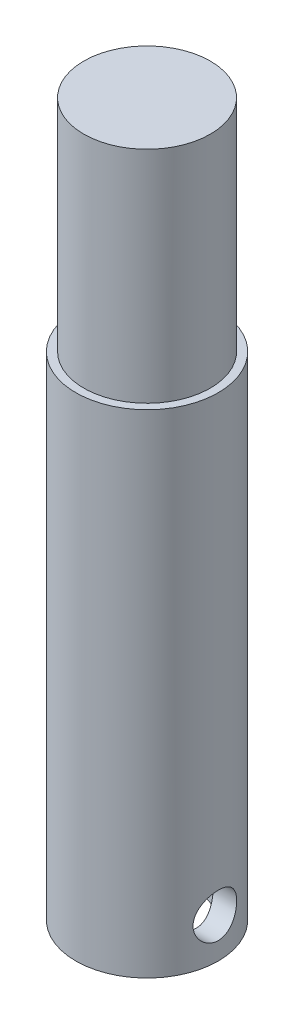
ISO-10303-21;
HEADER;
FILE_DESCRIPTION(('STEP AP214'),'2;1');
FILE_NAME('part.step','',(''),(''),'','','');
FILE_SCHEMA(('AUTOMOTIVE_DESIGN { 1 0 10303 214 1 1 1 1 }'));
ENDSEC;
DATA;
#1=APPLICATION_CONTEXT('core data for automotive mechanical design processes');
#2=APPLICATION_PROTOCOL_DEFINITION('international standard','automotive_design',2000,#1);
#3=PRODUCT_CONTEXT('',#1,'mechanical');
#4=PRODUCT('Part','Part','',(#3));
#5=PRODUCT_RELATED_PRODUCT_CATEGORY('part','',(#4));
#6=PRODUCT_DEFINITION_FORMATION('','',#4);
#7=PRODUCT_DEFINITION_CONTEXT('part definition',#1,'design');
#8=PRODUCT_DEFINITION('design','',#6,#7);
#9=PRODUCT_DEFINITION_SHAPE('','',#8);
#10=(LENGTH_UNIT() NAMED_UNIT(*) SI_UNIT(.MILLI.,.METRE.));
#11=(NAMED_UNIT(*) PLANE_ANGLE_UNIT() SI_UNIT($,.RADIAN.));
#12=(NAMED_UNIT(*) SI_UNIT($,.STERADIAN.) SOLID_ANGLE_UNIT());
#13=UNCERTAINTY_MEASURE_WITH_UNIT(LENGTH_MEASURE(1.E-05),#10,'distance_accuracy_value','');
#14=(GEOMETRIC_REPRESENTATION_CONTEXT(3) GLOBAL_UNCERTAINTY_ASSIGNED_CONTEXT((#13)) GLOBAL_UNIT_ASSIGNED_CONTEXT((#10,
#11,#12)) REPRESENTATION_CONTEXT('',''));
#15=CARTESIAN_POINT('',(0.,0.,0.));
#16=DIRECTION('',(0.,0.,1.));
#17=DIRECTION('',(1.,0.,0.));
#18=AXIS2_PLACEMENT_3D('',#15,#16,#17);
#19=CARTESIAN_POINT('',(0.,0.,0.));
#20=DIRECTION('',(0.,1.,0.));
#21=DIRECTION('',(0.,0.,1.));
#22=AXIS2_PLACEMENT_3D('',#19,#20,#21);
#23=PLANE('',#22);
#24=CARTESIAN_POINT('',(0.,0.,0.));
#25=DIRECTION('',(0.,-1.,0.));
#26=DIRECTION('',(0.,0.,-1.));
#27=AXIS2_PLACEMENT_3D('',#24,#25,#26);
#28=CIRCLE('',#27,3.96875);
#29=CARTESIAN_POINT('',(0.,0.,-3.96875));
#30=VERTEX_POINT('',#29);
#31=EDGE_CURVE('E117',#30,#30,#28,.T.);
#32=ORIENTED_EDGE('',*,*,#31,.F.);
#33=EDGE_LOOP('',(#32));
#34=FACE_BOUND('',#33,.T.);
#35=CARTESIAN_POINT('',(0.,0.,0.));
#36=DIRECTION('',(0.,1.,0.));
#37=DIRECTION('',(0.,0.,1.));
#38=AXIS2_PLACEMENT_3D('',#35,#36,#37);
#39=CIRCLE('',#38,5.715);
#40=CARTESIAN_POINT('',(0.,0.,5.715));
#41=VERTEX_POINT('',#40);
#42=EDGE_CURVE('E120',#41,#41,#39,.T.);
#43=ORIENTED_EDGE('',*,*,#42,.F.);
#44=EDGE_LOOP('',(#43));
#45=FACE_BOUND('',#44,.T.);
#46=ADVANCED_FACE('F45',(#34,#45),#23,.F.);
#47=CARTESIAN_POINT('',(0.,6.35,0.));
#48=DIRECTION('',(0.,-1.,0.));
#49=DIRECTION('',(0.,0.,-1.));
#50=AXIS2_PLACEMENT_3D('',#47,#48,#49);
#51=CYLINDRICAL_SURFACE('',#50,3.96875);
#52=CARTESIAN_POINT('',(-3.56208879205727,3.175,-1.75));
#53=CARTESIAN_POINT('',(-3.56209353838593,3.08224740691797,-1.74999563319547));
#54=CARTESIAN_POINT('',(-3.56576407056318,2.98934259981376,-1.74257902061585));
#55=CARTESIAN_POINT('',(-3.57995211973844,2.80626235860172,-1.71323438723364));
#56=CARTESIAN_POINT('',(-3.5904871603377,2.71609452964493,-1.69126922476247));
#57=CARTESIAN_POINT('',(-3.61696251479822,2.54146570624595,-1.63387370994394));
#58=CARTESIAN_POINT('',(-3.63287896212464,2.45698145522823,-1.59850273000797));
#59=CARTESIAN_POINT('',(-3.66828751091445,2.29516823960994,-1.51547774519868));
#60=CARTESIAN_POINT('',(-3.68777906305451,2.21783817849355,-1.46782562689624));
#61=CARTESIAN_POINT('',(-3.72966266869336,2.06708166582086,-1.35803293293338));
#62=CARTESIAN_POINT('',(-3.75216027824898,1.99421391145088,-1.29516509833842));
#63=CARTESIAN_POINT('',(-3.7966585858724,1.85963705486942,-1.15824885061117));
#64=CARTESIAN_POINT('',(-3.81865907520989,1.79793256639501,-1.08419583778055));
#65=CARTESIAN_POINT('',(-3.86099382006362,1.68446054672912,-0.922506160523575));
#66=CARTESIAN_POINT('',(-3.88119127911691,1.63333780227249,-0.83437788622718));
#67=CARTESIAN_POINT('',(-3.91633169743546,1.54688960151139,-0.649718371395728));
#68=CARTESIAN_POINT('',(-3.93127725444704,1.51155633290805,-0.553191314708836));
#69=CARTESIAN_POINT('',(-3.95347834999868,1.45976542764851,-0.360355757586166));
#70=CARTESIAN_POINT('',(-3.96112637963048,1.44233993556338,-0.264353338726685));
#71=CARTESIAN_POINT('',(-3.96930722106238,1.42371534042764,-0.0705036002533178));
#72=CARTESIAN_POINT('',(-3.96984328957249,1.42250881038484,0.0273428543820264));
#73=CARTESIAN_POINT('',(-3.96395886355778,1.43588531871159,0.215001917879778));
#74=CARTESIAN_POINT('',(-3.95800899588929,1.4494001107015,0.304908340775179));
#75=CARTESIAN_POINT('',(-3.9404855814644,1.48998259360306,0.481024011713773));
#76=CARTESIAN_POINT('',(-3.92891161837739,1.5170512878636,0.567232985534499));
#77=CARTESIAN_POINT('',(-3.90101968793415,1.58426926754532,0.735104863073158));
#78=CARTESIAN_POINT('',(-3.88463198291737,1.62461196920836,0.816678254143855));
#79=CARTESIAN_POINT('',(-3.84868139397731,1.71702809000756,0.972111971682959));
#80=CARTESIAN_POINT('',(-3.82911735624179,1.76910577458765,1.04596947925099));
#81=CARTESIAN_POINT('',(-3.78695193640457,1.88819626988817,1.18997020754851));
#82=CARTESIAN_POINT('',(-3.7642326663637,1.95605425426668,1.25938087431697));
#83=CARTESIAN_POINT('',(-3.71941135415986,2.10243498505653,1.38617737278033));
#84=CARTESIAN_POINT('',(-3.69730961437482,2.18096284941567,1.44355740002509));
#85=CARTESIAN_POINT('',(-3.65532460083709,2.3504296743786,1.54687431413554));
#86=CARTESIAN_POINT('',(-3.63556733412784,2.44174233830917,1.59225401038565));
#87=CARTESIAN_POINT('',(-3.60205795871447,2.63181194458514,1.66668544323578));
#88=CARTESIAN_POINT('',(-3.58830096562557,2.7305627549909,1.69575046597237));
#89=CARTESIAN_POINT('',(-3.56960518418745,2.92534472715134,1.73474330947598));
#90=CARTESIAN_POINT('',(-3.56411638258773,3.02108214651399,1.74586863973841));
#91=CARTESIAN_POINT('',(-3.56100105508922,3.21319290466881,1.75221765766862));
#92=CARTESIAN_POINT('',(-3.56337121546327,3.30956595834333,1.74744804742538));
#93=CARTESIAN_POINT('',(-3.57513324783105,3.49252520823142,1.7232383324921));
#94=CARTESIAN_POINT('',(-3.58398179461918,3.57930117106894,1.70493236127572));
#95=CARTESIAN_POINT('',(-3.60697879849733,3.74845544413854,1.65572114712787));
#96=CARTESIAN_POINT('',(-3.62112859785241,3.83083263457101,1.62481271310638));
#97=CARTESIAN_POINT('',(-3.65389481747196,3.99296259218139,1.54976490211927));
#98=CARTESIAN_POINT('',(-3.67268195932917,4.07243551616474,1.50509802943803));
#99=CARTESIAN_POINT('',(-3.71238927150009,4.22316743507872,1.40430554568507));
#100=CARTESIAN_POINT('',(-3.73331043383616,4.29442257679055,1.34817459314898));
#101=CARTESIAN_POINT('',(-3.77727956071602,4.43362099149512,1.21989455557735));
#102=CARTESIAN_POINT('',(-3.80034398865355,4.50063639388688,1.14674005876275));
#103=CARTESIAN_POINT('',(-3.84422469457359,4.62164138857364,0.989723349920827));
#104=CARTESIAN_POINT('',(-3.86504067624988,4.67562926522068,0.905859729786865));
#105=CARTESIAN_POINT('',(-3.90233949997183,4.76925178626268,0.728677439196114));
#106=CARTESIAN_POINT('',(-3.91878776807016,4.80877279273064,0.635290981699206));
#107=CARTESIAN_POINT('',(-3.94522903213664,4.8712202956881,0.442273890308923));
#108=CARTESIAN_POINT('',(-3.95522638147468,4.89415798460713,0.34264751730459));
#109=CARTESIAN_POINT('',(-3.96708486555638,4.92125842265785,0.148218466465073));
#110=CARTESIAN_POINT('',(-3.96951062715961,4.92672486607173,0.0536309408712299));
#111=CARTESIAN_POINT('',(-3.96757122067091,4.92232672090087,-0.135104825907965));
#112=CARTESIAN_POINT('',(-3.96320751248676,4.91246542816763,-0.229253157165397));
#113=CARTESIAN_POINT('',(-3.94849255842105,4.87862346373568,-0.4102177359374));
#114=CARTESIAN_POINT('',(-3.93840800526532,4.85527088780818,-0.497175040256969));
#115=CARTESIAN_POINT('',(-3.913420989435,4.79583685216382,-0.665875986453617));
#116=CARTESIAN_POINT('',(-3.89851767217411,4.7597531345322,-0.747618700465384));
#117=CARTESIAN_POINT('',(-3.86445798292642,4.6740574513603,-0.907714806758724));
#118=CARTESIAN_POINT('',(-3.84513801057888,4.62390132695005,-0.985741229116449));
#119=CARTESIAN_POINT('',(-3.80446881641556,4.51223907776838,-1.13261229457055));
#120=CARTESIAN_POINT('',(-3.78311874898595,4.45072821317317,-1.20145308254436));
#121=CARTESIAN_POINT('',(-3.73869080353766,4.31251361184784,-1.33356456338859));
#122=CARTESIAN_POINT('',(-3.71560713068347,4.23500231939152,-1.39599136661912));
#123=CARTESIAN_POINT('',(-3.67193674837275,4.06996527552658,-1.50712793845824));
#124=CARTESIAN_POINT('',(-3.65135157638443,3.98243342162634,-1.55582928514161));
#125=CARTESIAN_POINT('',(-3.61524974380851,3.79920497474954,-1.6379790330275));
#126=CARTESIAN_POINT('',(-3.59974592369513,3.70348845643481,-1.67138887600855));
#127=CARTESIAN_POINT('',(-3.57621311955068,3.50702445583213,-1.72117916216989));
#128=CARTESIAN_POINT('',(-3.56815906490183,3.4062950584507,-1.73761674380392));
#129=CARTESIAN_POINT('',(-3.56366883587143,3.28332782715188,-1.74677964847133));
#130=CARTESIAN_POINT('',(-3.56307756802898,3.26168661239528,-1.74798610752484));
#131=CARTESIAN_POINT('',(-3.5622869863916,3.21836637296077,-1.74959680371416));
#132=CARTESIAN_POINT('',(-3.56208768227397,3.19668734736256,-1.75000102104323));
#133=CARTESIAN_POINT('',(-3.56208879205727,3.175,-1.75));
#134=B_SPLINE_CURVE_WITH_KNOTS('',3,(#52,#53,#54,#55,#56,#57,#58,#59,#60,#61,#62,#63,#64,#65,
#66,#67,#68,#69,#70,#71,#72,#73,#74,#75,#76,#77,#78,#79,#80,#81,#82,#83,#84,#85,#86,#87,#88,#89,
#90,#91,#92,#93,#94,#95,#96,#97,#98,#99,#100,#101,#102,#103,#104,#105,#106,#107,#108,#109,#110,
#111,#112,#113,#114,#115,#116,#117,#118,#119,#120,#121,#122,#123,#124,#125,#126,#127,#128,#129,
#130,#131,#132,#133),.UNSPECIFIED.,.T.,.F.,(4,2,2,2,2,2,2,2,2,2,2,2,2,2,2,2,2,2,2,2,2,2,2,2,2,2,
2,2,2,2,2,2,2,2,2,2,2,2,2,2,4),(0.,0.278166493433298,0.557045882401051,0.834704320937761,
1.11232013228369,1.40754438936983,1.70289038420353,2.01288757708766,2.3227312196294,
2.61477292458695,2.90668089315732,3.17873660303953,3.45081245525045,3.72704262376208,
4.0033733591295,4.30113958614739,4.5990491481955,4.90901711969207,5.21873229581556,
5.50676075035845,5.79466777330182,6.06085047730066,6.32710062375157,6.60519700096026,
6.88342324856538,7.18758462827953,7.49178604241135,7.79832814657264,8.10466316539236,
8.38753046958766,8.67033695856148,8.94093121191268,9.21157348029251,9.4946179362679,
9.7777808121338,10.0828667001033,10.3881393828817,10.6941776402949,10.9991822028825,
11.0642212948376,11.1292619925394),.UNSPECIFIED.);
#135=CARTESIAN_POINT('',(-3.56208879205727,3.175,-1.75));
#136=VERTEX_POINT('',#135);
#137=EDGE_CURVE('E95',#136,#136,#134,.T.);
#138=ORIENTED_EDGE('',*,*,#137,.T.);
#139=EDGE_LOOP('',(#138));
#140=FACE_BOUND('',#139,.T.);
#141=CARTESIAN_POINT('',(3.56208879205727,3.175,-1.75));
#142=CARTESIAN_POINT('',(3.56209353838593,3.26775259308203,-1.74999563319547));
#143=CARTESIAN_POINT('',(3.56576407056318,3.36065740018624,-1.74257902061585));
#144=CARTESIAN_POINT('',(3.57995211973844,3.54373764139828,-1.71323438723364));
#145=CARTESIAN_POINT('',(3.5904871603377,3.63390547035507,-1.69126922476247));
#146=CARTESIAN_POINT('',(3.61696251479822,3.80853429375405,-1.63387370994394));
#147=CARTESIAN_POINT('',(3.63287896212464,3.89301854477177,-1.59850273000797));
#148=CARTESIAN_POINT('',(3.66828751091445,4.05483176039005,-1.51547774519868));
#149=CARTESIAN_POINT('',(3.68777906305451,4.13216182150645,-1.46782562689624));
#150=CARTESIAN_POINT('',(3.72966266869336,4.28291833417914,-1.35803293293338));
#151=CARTESIAN_POINT('',(3.75216027824898,4.35578608854912,-1.29516509833842));
#152=CARTESIAN_POINT('',(3.7966585858724,4.49036294513058,-1.15824885061117));
#153=CARTESIAN_POINT('',(3.81865907520989,4.55206743360499,-1.08419583778055));
#154=CARTESIAN_POINT('',(3.86099382006362,4.66553945327088,-0.922506160523575));
#155=CARTESIAN_POINT('',(3.88119127911691,4.71666219772751,-0.834377886227179));
#156=CARTESIAN_POINT('',(3.91633169743546,4.80311039848861,-0.649718371395727));
#157=CARTESIAN_POINT('',(3.93127725444704,4.83844366709194,-0.553191314708836));
#158=CARTESIAN_POINT('',(3.95347834999868,4.89023457235149,-0.360355757586165));
#159=CARTESIAN_POINT('',(3.96112637963048,4.90766006443662,-0.264353338726685));
#160=CARTESIAN_POINT('',(3.96930722106238,4.92628465957236,-0.0705036002533174));
#161=CARTESIAN_POINT('',(3.96984328957249,4.92749118961516,0.0273428543820268));
#162=CARTESIAN_POINT('',(3.96395886355778,4.91411468128841,0.215001917879779));
#163=CARTESIAN_POINT('',(3.95800899588929,4.9005998892985,0.304908340775179));
#164=CARTESIAN_POINT('',(3.9404855814644,4.86001740639694,0.481024011713773));
#165=CARTESIAN_POINT('',(3.92891161837739,4.8329487121364,0.567232985534499));
#166=CARTESIAN_POINT('',(3.90101968793415,4.76573073245468,0.735104863073158));
#167=CARTESIAN_POINT('',(3.88463198291737,4.72538803079164,0.816678254143855));
#168=CARTESIAN_POINT('',(3.84868139397731,4.63297190999244,0.972111971682959));
#169=CARTESIAN_POINT('',(3.82911735624179,4.58089422541235,1.04596947925099));
#170=CARTESIAN_POINT('',(3.78695193640457,4.46180373011183,1.18997020754851));
#171=CARTESIAN_POINT('',(3.7642326663637,4.39394574573332,1.25938087431697));
#172=CARTESIAN_POINT('',(3.71941135415986,4.24756501494346,1.38617737278033));
#173=CARTESIAN_POINT('',(3.69730961437482,4.16903715058433,1.44355740002509));
#174=CARTESIAN_POINT('',(3.65532460083709,3.9995703256214,1.54687431413554));
#175=CARTESIAN_POINT('',(3.63556733412784,3.90825766169083,1.59225401038565));
#176=CARTESIAN_POINT('',(3.60205795871447,3.71818805541486,1.66668544323578));
#177=CARTESIAN_POINT('',(3.58830096562557,3.6194372450091,1.69575046597237));
#178=CARTESIAN_POINT('',(3.56960518418745,3.42465527284866,1.73474330947598));
#179=CARTESIAN_POINT('',(3.56411638258773,3.32891785348601,1.74586863973841));
#180=CARTESIAN_POINT('',(3.56100105508922,3.13680709533119,1.75221765766862));
#181=CARTESIAN_POINT('',(3.56337121546327,3.04043404165667,1.74744804742538));
#182=CARTESIAN_POINT('',(3.57513324783105,2.85747479176858,1.7232383324921));
#183=CARTESIAN_POINT('',(3.58398179461918,2.77069882893106,1.70493236127572));
#184=CARTESIAN_POINT('',(3.60697879849733,2.60154455586146,1.65572114712787));
#185=CARTESIAN_POINT('',(3.62112859785241,2.51916736542899,1.62481271310638));
#186=CARTESIAN_POINT('',(3.65389481747196,2.35703740781861,1.54976490211927));
#187=CARTESIAN_POINT('',(3.67268195932917,2.27756448383526,1.50509802943803));
#188=CARTESIAN_POINT('',(3.71238927150009,2.12683256492128,1.40430554568507));
#189=CARTESIAN_POINT('',(3.73331043383616,2.05557742320946,1.34817459314898));
#190=CARTESIAN_POINT('',(3.77727956071602,1.91637900850488,1.21989455557736));
#191=CARTESIAN_POINT('',(3.80034398865355,1.84936360611312,1.14674005876275));
#192=CARTESIAN_POINT('',(3.84422469457359,1.72835861142636,0.989723349920828));
#193=CARTESIAN_POINT('',(3.86504067624988,1.67437073477932,0.905859729786866));
#194=CARTESIAN_POINT('',(3.90233949997183,1.58074821373732,0.728677439196115));
#195=CARTESIAN_POINT('',(3.91878776807016,1.54122720726936,0.635290981699207));
#196=CARTESIAN_POINT('',(3.94522903213664,1.4787797043119,0.442273890308924));
#197=CARTESIAN_POINT('',(3.95522638147468,1.45584201539287,0.342647517304591));
#198=CARTESIAN_POINT('',(3.96708486555638,1.42874157734215,0.148218466465074));
#199=CARTESIAN_POINT('',(3.96951062715961,1.42327513392827,0.0536309408712306));
#200=CARTESIAN_POINT('',(3.96757122067091,1.42767327909913,-0.135104825907965));
#201=CARTESIAN_POINT('',(3.96320751248676,1.43753457183237,-0.229253157165396));
#202=CARTESIAN_POINT('',(3.94849255842105,1.47137653626432,-0.410217735937399));
#203=CARTESIAN_POINT('',(3.93840800526532,1.49472911219182,-0.497175040256968));
#204=CARTESIAN_POINT('',(3.913420989435,1.55416314783618,-0.665875986453616));
#205=CARTESIAN_POINT('',(3.89851767217411,1.5902468654678,-0.747618700465384));
#206=CARTESIAN_POINT('',(3.86445798292642,1.6759425486397,-0.907714806758724));
#207=CARTESIAN_POINT('',(3.84513801057888,1.72609867304995,-0.985741229116449));
#208=CARTESIAN_POINT('',(3.80446881641556,1.83776092223162,-1.13261229457055));
#209=CARTESIAN_POINT('',(3.78311874898595,1.89927178682683,-1.20145308254436));
#210=CARTESIAN_POINT('',(3.73869080353766,2.03748638815215,-1.33356456338859));
#211=CARTESIAN_POINT('',(3.71560713068347,2.11499768060848,-1.39599136661912));
#212=CARTESIAN_POINT('',(3.67193674837275,2.28003472447342,-1.50712793845824));
#213=CARTESIAN_POINT('',(3.65135157638443,2.36756657837366,-1.55582928514161));
#214=CARTESIAN_POINT('',(3.61524974380851,2.55079502525046,-1.6379790330275));
#215=CARTESIAN_POINT('',(3.59974592369513,2.64651154356518,-1.67138887600855));
#216=CARTESIAN_POINT('',(3.57621311955068,2.84297554416787,-1.72117916216989));
#217=CARTESIAN_POINT('',(3.56815906490183,2.9437049415493,-1.73761674380392));
#218=CARTESIAN_POINT('',(3.56366883587143,3.06667217284812,-1.74677964847133));
#219=CARTESIAN_POINT('',(3.56307756802898,3.08831338760472,-1.74798610752484));
#220=CARTESIAN_POINT('',(3.5622869863916,3.13163362703923,-1.74959680371416));
#221=CARTESIAN_POINT('',(3.56208768227397,3.15331265263744,-1.75000102104323));
#222=CARTESIAN_POINT('',(3.56208879205727,3.175,-1.75));
#223=B_SPLINE_CURVE_WITH_KNOTS('',3,(#141,#142,#143,#144,#145,#146,#147,#148,#149,#150,#151,
#152,#153,#154,#155,#156,#157,#158,#159,#160,#161,#162,#163,#164,#165,#166,#167,#168,#169,#170,
#171,#172,#173,#174,#175,#176,#177,#178,#179,#180,#181,#182,#183,#184,#185,#186,#187,#188,#189,
#190,#191,#192,#193,#194,#195,#196,#197,#198,#199,#200,#201,#202,#203,#204,#205,#206,#207,#208,
#209,#210,#211,#212,#213,#214,#215,#216,#217,#218,#219,#220,#221,#222),.UNSPECIFIED.,.T.,.F.,(4,
2,2,2,2,2,2,2,2,2,2,2,2,2,2,2,2,2,2,2,2,2,2,2,2,2,2,2,2,2,2,2,2,2,2,2,2,2,2,2,4),(0.,
0.278166493433298,0.557045882401051,0.83470432093776,1.11232013228369,1.40754438936983,
1.70289038420353,2.01288757708766,2.3227312196294,2.61477292458695,2.90668089315732,
3.17873660303953,3.45081245525045,3.72704262376208,4.0033733591295,4.30113958614739,
4.5990491481955,4.90901711969207,5.21873229581556,5.50676075035845,5.79466777330182,
6.06085047730066,6.32710062375157,6.60519700096026,6.88342324856538,7.18758462827953,
7.49178604241135,7.79832814657264,8.10466316539236,8.38753046958766,8.67033695856148,
8.94093121191268,9.21157348029251,9.4946179362679,9.7777808121338,10.0828667001033,
10.3881393828817,10.6941776402949,10.9991822028825,11.0642212948376,11.1292619925394),.UNSPECIFIED.);
#224=CARTESIAN_POINT('',(3.56208879205727,3.175,-1.75));
#225=VERTEX_POINT('',#224);
#226=EDGE_CURVE('E88',#225,#225,#223,.T.);
#227=ORIENTED_EDGE('',*,*,#226,.T.);
#228=EDGE_LOOP('',(#227));
#229=FACE_BOUND('',#228,.T.);
#230=CARTESIAN_POINT('',(0.,6.35,0.));
#231=DIRECTION('',(0.,-1.,0.));
#232=DIRECTION('',(0.,0.,-1.));
#233=AXIS2_PLACEMENT_3D('',#230,#231,#232);
#234=CIRCLE('',#233,3.96875);
#235=CARTESIAN_POINT('',(0.,6.35,-3.96875));
#236=VERTEX_POINT('',#235);
#237=EDGE_CURVE('E130',#236,#236,#234,.T.);
#238=ORIENTED_EDGE('',*,*,#237,.F.);
#239=EDGE_LOOP('',(#238));
#240=FACE_BOUND('',#239,.T.);
#241=ORIENTED_EDGE('',*,*,#31,.T.);
#242=EDGE_LOOP('',(#241));
#243=FACE_BOUND('',#242,.T.);
#244=ADVANCED_FACE('F100',(#140,#229,#240,#243),#51,.F.);
#245=CARTESIAN_POINT('',(0.,6.35,0.));
#246=DIRECTION('',(0.,-1.,0.));
#247=DIRECTION('',(0.,0.,-1.));
#248=AXIS2_PLACEMENT_3D('',#245,#246,#247);
#249=PLANE('',#248);
#250=ORIENTED_EDGE('',*,*,#237,.T.);
#251=EDGE_LOOP('',(#250));
#252=FACE_BOUND('',#251,.T.);
#253=ADVANCED_FACE('F104',(#252),#249,.T.);
#254=CARTESIAN_POINT('',(0.,39.497,0.));
#255=DIRECTION('',(0.,-1.,0.));
#256=DIRECTION('',(0.,0.,-1.));
#257=AXIS2_PLACEMENT_3D('',#254,#255,#256);
#258=CYLINDRICAL_SURFACE('',#257,5.715);
#259=CARTESIAN_POINT('',(-5.715,1.425,0.));
#260=CARTESIAN_POINT('',(-5.71499933878539,1.42500090502686,0.0959105376349673));
#261=CARTESIAN_POINT('',(-5.71256267092111,1.43291077613335,0.191830286094759));
#262=CARTESIAN_POINT('',(-5.70308070171076,1.46426232295809,0.380870678624068));
#263=CARTESIAN_POINT('',(-5.69603418963078,1.48770807905694,0.47399058061693));
#264=CARTESIAN_POINT('',(-5.6781034926652,1.54927093803264,0.654677652829268));
#265=CARTESIAN_POINT('',(-5.66722510937339,1.58736586947046,0.742252982565757));
#266=CARTESIAN_POINT('',(-5.64275766193928,1.6770531017474,0.909772960374643));
#267=CARTESIAN_POINT('',(-5.62916820406674,1.72864736343807,0.98971649758304));
#268=CARTESIAN_POINT('',(-5.6002720150372,1.84548708937687,1.14208483325031));
#269=CARTESIAN_POINT('',(-5.5849289894191,1.91106170147808,1.21425032829375));
#270=CARTESIAN_POINT('',(-5.55446831605243,2.05329953161953,1.346750974844));
#271=CARTESIAN_POINT('',(-5.5393507086191,2.1299647075413,1.40708403306271));
#272=CARTESIAN_POINT('',(-5.51066587497236,2.29442644406832,1.51559207971788));
#273=CARTESIAN_POINT('',(-5.49714360070039,2.38244281682218,1.56344691216123));
#274=CARTESIAN_POINT('',(-5.47372461841809,2.56575495925193,1.64356891695786));
#275=CARTESIAN_POINT('',(-5.46382699857342,2.66104889085229,1.67584001027832));
#276=CARTESIAN_POINT('',(-5.44915689171517,2.85329222282893,1.72293664903074));
#277=CARTESIAN_POINT('',(-5.44424388487618,2.9501131330558,1.738241710659));
#278=CARTESIAN_POINT('',(-5.43968164439273,3.1450635323483,1.7524695450511));
#279=CARTESIAN_POINT('',(-5.44003107483807,3.24319268298744,1.75139647552864));
#280=CARTESIAN_POINT('',(-5.44582993585211,3.43404175543601,1.73327436202092));
#281=CARTESIAN_POINT('',(-5.45108620258058,3.52682598043924,1.71683038151631));
#282=CARTESIAN_POINT('',(-5.4657933474506,3.70824977385141,1.66941250842952));
#283=CARTESIAN_POINT('',(-5.47524465519698,3.79688891674379,1.63843712770043));
#284=CARTESIAN_POINT('',(-5.49742809254365,3.96896735338063,1.56239914319658));
#285=CARTESIAN_POINT('',(-5.51020475828325,4.05231530923917,1.51714338581371));
#286=CARTESIAN_POINT('',(-5.53757839025475,4.21043467481122,1.41396348717052));
#287=CARTESIAN_POINT('',(-5.55217581297127,4.28520392468788,1.3560361662491));
#288=CARTESIAN_POINT('',(-5.58232542263652,4.42746981229585,1.2261701590826));
#289=CARTESIAN_POINT('',(-5.59789148602254,4.49450713688054,1.15373063383097));
#290=CARTESIAN_POINT('',(-5.62766171466692,4.61559153203309,0.998443926443386));
#291=CARTESIAN_POINT('',(-5.64186578685801,4.66963771527287,0.915596033977553));
#292=CARTESIAN_POINT('',(-5.66745073888408,4.7635003752016,0.740984772884136));
#293=CARTESIAN_POINT('',(-5.678810473439,4.80321119001861,0.649161298714906));
#294=CARTESIAN_POINT('',(-5.69727432238391,4.86648838595196,0.45970962674507));
#295=CARTESIAN_POINT('',(-5.70437967536649,4.89005946617137,0.362083127506562));
#296=CARTESIAN_POINT('',(-5.71333659948943,4.91961468920723,0.167698452183473));
#297=CARTESIAN_POINT('',(-5.7153739390807,4.9262209850956,0.0710432911954652));
#298=CARTESIAN_POINT('',(-5.71451246151643,4.92340801384639,-0.122002790174385));
#299=CARTESIAN_POINT('',(-5.71161433372543,4.91399098477703,-0.218393745575812));
#300=CARTESIAN_POINT('',(-5.70132940087086,4.87990000061465,-0.405801649791657));
#301=CARTESIAN_POINT('',(-5.69405058776105,4.85559286455543,-0.496891817671331));
#302=CARTESIAN_POINT('',(-5.67585114377866,4.79285607135071,-0.673678392958762));
#303=CARTESIAN_POINT('',(-5.66493006889489,4.75442469232613,-0.759374141243088));
#304=CARTESIAN_POINT('',(-5.64025038629359,4.66350717393184,-0.925202674061905));
#305=CARTESIAN_POINT('',(-5.62643052247156,4.61070878054488,-1.00515489711667));
#306=CARTESIAN_POINT('',(-5.59753683558334,4.49293303553034,-1.15527486363836));
#307=CARTESIAN_POINT('',(-5.58246268598276,4.42795250691563,-1.22544004639289));
#308=CARTESIAN_POINT('',(-5.55204102313051,4.28473217991202,-1.356755524352));
#309=CARTESIAN_POINT('',(-5.53670483924734,4.20608283769874,-1.4174627564114));
#310=CARTESIAN_POINT('',(-5.50809841381302,4.03937987562082,-1.52485284571177));
#311=CARTESIAN_POINT('',(-5.49482812796774,3.95132645745361,-1.57153600365744));
#312=CARTESIAN_POINT('',(-5.47200635749272,3.76854905147947,-1.64924671300812));
#313=CARTESIAN_POINT('',(-5.46243894096489,3.67385575967808,-1.68034150926182));
#314=CARTESIAN_POINT('',(-5.44817281599433,3.48022690078843,-1.72604236233823));
#315=CARTESIAN_POINT('',(-5.44347234941757,3.38129287907786,-1.74065437356286));
#316=CARTESIAN_POINT('',(-5.43965048518986,3.1866078609664,-1.75255871859854));
#317=CARTESIAN_POINT('',(-5.44029570120774,3.09090518271927,-1.75057554013731));
#318=CARTESIAN_POINT('',(-5.44652850350312,2.90126627713779,-1.73108480170035));
#319=CARTESIAN_POINT('',(-5.45211587611416,2.80732997361627,-1.71357791286808));
#320=CARTESIAN_POINT('',(-5.46744363230402,2.62512929313146,-1.66401302274156));
#321=CARTESIAN_POINT('',(-5.47712698469422,2.53680550350335,-1.63215446792962));
#322=CARTESIAN_POINT('',(-5.49954310774988,2.36668617764634,-1.55494667341684));
#323=CARTESIAN_POINT('',(-5.51227648041581,2.28489193444711,-1.50959477002588));
#324=CARTESIAN_POINT('',(-5.5399579717736,2.12681105127648,-1.40468336221929));
#325=CARTESIAN_POINT('',(-5.55497156820577,2.0508490430787,-1.34465200449388));
#326=CARTESIAN_POINT('',(-5.58521229008079,1.90984218620803,-1.21292567757467));
#327=CARTESIAN_POINT('',(-5.60043947078472,1.8448002215386,-1.14122763700293));
#328=CARTESIAN_POINT('',(-5.62995592975215,1.72547238686421,-0.985536187991602));
#329=CARTESIAN_POINT('',(-5.64420168883985,1.6715809744568,-0.901231315186408));
#330=CARTESIAN_POINT('',(-5.66961629261016,1.57880980762083,-0.724321730343206));
#331=CARTESIAN_POINT('',(-5.68078646387779,1.53992357813243,-0.631720619614398));
#332=CARTESIAN_POINT('',(-5.69791251501842,1.48142822647745,-0.450034019851795));
#333=CARTESIAN_POINT('',(-5.70426605628917,1.46032674774554,-0.361464599688558));
#334=CARTESIAN_POINT('',(-5.7128097295898,1.43211349146773,-0.181932586380966));
#335=CARTESIAN_POINT('',(-5.71500062715717,1.42499914158871,-0.0909704363955801));
#336=CARTESIAN_POINT('',(-5.715,1.425,0.));
#337=B_SPLINE_CURVE_WITH_KNOTS('',3,(#259,#260,#261,#262,#263,#264,#265,#266,#267,#268,#269,
#270,#271,#272,#273,#274,#275,#276,#277,#278,#279,#280,#281,#282,#283,#284,#285,#286,#287,#288,
#289,#290,#291,#292,#293,#294,#295,#296,#297,#298,#299,#300,#301,#302,#303,#304,#305,#306,#307,
#308,#309,#310,#311,#312,#313,#314,#315,#316,#317,#318,#319,#320,#321,#322,#323,#324,#325,#326,
#327,#328,#329,#330,#331,#332,#333,#334,#335,#336),.UNSPECIFIED.,.T.,.F.,(4,2,2,2,2,2,2,2,2,2,2,
2,2,2,2,2,2,2,2,2,2,2,2,2,2,2,2,2,2,2,2,2,2,2,2,2,2,2,4),(0.,0.287397348285755,
0.574870209207296,0.861909683302508,1.14899087462053,1.44377514442864,1.7386115178632,
2.04039861071619,2.34210973241687,2.63505698531279,2.92792987254817,3.20973876002303,
3.49157651358101,3.77740272726905,4.0633007454465,4.36166586363314,4.66005135513107,
4.96059329797726,5.26104770042725,5.55031499692299,5.83954189313945,6.12191520898195,
6.40432296023289,6.69344092449817,6.98263439318094,7.2828006584655,7.5829604871146,
7.88181410239654,8.18055972227654,8.46633352244674,8.75209496823402,9.0340021375065,
9.31596499437426,9.60857575816339,9.90126367983997,10.2029954909937,10.5045969523711,
10.7772413599863,11.0498356216512),.UNSPECIFIED.);
#338=CARTESIAN_POINT('',(-5.715,1.425,0.));
#339=VERTEX_POINT('',#338);
#340=EDGE_CURVE('E10',#339,#339,#337,.T.);
#341=ORIENTED_EDGE('',*,*,#340,.F.);
#342=EDGE_LOOP('',(#341));
#343=FACE_BOUND('',#342,.T.);
#344=CARTESIAN_POINT('',(5.44047102740195,3.175,-1.75));
#345=CARTESIAN_POINT('',(5.44047183118905,3.27079151122676,-1.74999906808508));
#346=CARTESIAN_POINT('',(5.44302864206558,3.36659226494913,-1.74210811856093));
#347=CARTESIAN_POINT('',(5.45293663765047,3.55538621777973,-1.71083853881123));
#348=CARTESIAN_POINT('',(5.46028927207925,3.64837855904179,-1.68745522539458));
#349=CARTESIAN_POINT('',(5.47887976314817,3.82879452677269,-1.6260747431724));
#350=CARTESIAN_POINT('',(5.49011095200076,3.91622740725928,-1.58810264204578));
#351=CARTESIAN_POINT('',(5.51518393734454,4.08350457216981,-1.49870548246737));
#352=CARTESIAN_POINT('',(5.52902615960126,4.16334761576672,-1.44727822943472));
#353=CARTESIAN_POINT('',(5.55827350335134,4.31581164437501,-1.33061463987437));
#354=CARTESIAN_POINT('',(5.57371297294671,4.38814543171694,-1.2650114977216));
#355=CARTESIAN_POINT('',(5.60412232370501,4.52097588644242,-1.12264385415869));
#356=CARTESIAN_POINT('',(5.61909214175443,4.58147096856986,-1.04587786038793));
#357=CARTESIAN_POINT('',(5.64726700390055,4.69016384407799,-0.881310325928528));
#358=CARTESIAN_POINT('',(5.66042687485869,4.73806736047403,-0.793306010349688));
#359=CARTESIAN_POINT('',(5.68309901252209,4.81828251929768,-0.610018774299463));
#360=CARTESIAN_POINT('',(5.69261210048561,4.85059767266029,-0.514737498408043));
#361=CARTESIAN_POINT('',(5.70667572676441,4.89776418348754,-0.322606879624484));
#362=CARTESIAN_POINT('',(5.71136536626367,4.91310608147587,-0.225888327394678));
#363=CARTESIAN_POINT('',(5.71574426197689,4.92744322403684,-0.0311438646930488));
#364=CARTESIAN_POINT('',(5.71543461095559,4.92644204094438,0.066881755394113));
#365=CARTESIAN_POINT('',(5.70994741692064,4.90844747407535,0.258010917994514));
#366=CARTESIAN_POINT('',(5.70493165898573,4.89198557564633,0.351169880867638));
#367=CARTESIAN_POINT('',(5.6907936124026,4.84440696799308,0.533333109898986));
#368=CARTESIAN_POINT('',(5.68167105970443,4.81328931645849,0.622337108503975));
#369=CARTESIAN_POINT('',(5.66012397875661,4.73693173211486,0.794909005009656));
#370=CARTESIAN_POINT('',(5.64766130859209,4.691527542325,0.878399265771299));
#371=CARTESIAN_POINT('',(5.62075156492628,4.58801656636049,1.03674337059055));
#372=CARTESIAN_POINT('',(5.60630400547589,4.52990666745267,1.11159509144095));
#373=CARTESIAN_POINT('',(5.57628291189903,4.39989094981731,1.2537079440354));
#374=CARTESIAN_POINT('',(5.56068745769152,4.32752544478709,1.32054446293592));
#375=CARTESIAN_POINT('',(5.53063146606323,4.17246419839894,1.44125649556107));
#376=CARTESIAN_POINT('',(5.51617105158446,4.08976734050613,1.49513060656212));
#377=CARTESIAN_POINT('',(5.48991475505363,3.91523274208261,1.58885637243465));
#378=CARTESIAN_POINT('',(5.4781480221724,3.82330919641081,1.62855701024752));
#379=CARTESIAN_POINT('',(5.4589552045312,3.63363568477559,1.69178529671528));
#380=CARTESIAN_POINT('',(5.451527633685,3.53588772622437,1.71531848292281));
#381=CARTESIAN_POINT('',(5.44218210782162,3.34139460055598,1.7447376308147));
#382=CARTESIAN_POINT('',(5.44006202317565,3.24475706370708,1.75127139631632));
#383=CARTESIAN_POINT('',(5.44101146390833,3.05176179482897,1.74831997530971));
#384=CARTESIAN_POINT('',(5.4440802261224,2.95540402374034,1.73883714448868));
#385=CARTESIAN_POINT('',(5.45486262195592,2.76844813773328,1.70469963856769));
#386=CARTESIAN_POINT('',(5.4624466367781,2.67776454528231,1.68046793939932));
#387=CARTESIAN_POINT('',(5.48126921978793,2.50175831201384,1.6180140234975));
#388=CARTESIAN_POINT('',(5.49250836806969,2.4164365247171,1.57978958590187));
#389=CARTESIAN_POINT('',(5.51776235653008,2.25095628484495,1.48922324587534));
#390=CARTESIAN_POINT('',(5.53184557531146,2.17100685471479,1.43651897440864));
#391=CARTESIAN_POINT('',(5.56105662990803,2.02085057832216,1.31891577582085));
#392=CARTESIAN_POINT('',(5.57618472568946,1.95064616980041,1.25401380693974));
#393=CARTESIAN_POINT('',(5.60650509512151,1.81910997528758,1.11080238404536));
#394=CARTESIAN_POINT('',(5.62167623959309,1.75823896648999,1.03206415453295));
#395=CARTESIAN_POINT('',(5.64977301458364,1.65055918943637,0.865126324225267));
#396=CARTESIAN_POINT('',(5.6626987527466,1.60374974699531,0.776927177311097));
#397=CARTESIAN_POINT('',(5.68477170536709,1.52597296849505,0.594136213068868));
#398=CARTESIAN_POINT('',(5.69394667837131,1.49488883009366,0.499597617907858));
#399=CARTESIAN_POINT('',(5.7076067157492,1.44915758930785,0.306305732915549));
#400=CARTESIAN_POINT('',(5.71209318357377,1.43450556805915,0.207553713542917));
#401=CARTESIAN_POINT('',(5.7157815414015,1.42244117960915,0.0128881097502701));
#402=CARTESIAN_POINT('',(5.7151878661053,1.42436191942831,-0.0829807723235325));
#403=CARTESIAN_POINT('',(5.70926833935835,1.44378518442852,-0.272969237877094));
#404=CARTESIAN_POINT('',(5.70394277575888,1.46128676179278,-0.367088927408565));
#405=CARTESIAN_POINT('',(5.68921932381747,1.51095616634498,-0.5498398025147));
#406=CARTESIAN_POINT('',(5.67986936472129,1.54295160460119,-0.638521969247591));
#407=CARTESIAN_POINT('',(5.65806254483458,1.62054561290621,-0.809303993538212));
#408=CARTESIAN_POINT('',(5.64560516200574,1.66614646887903,-0.8914027420349));
#409=CARTESIAN_POINT('',(5.61837718881819,1.77139739167076,-1.04963016403995));
#410=CARTESIAN_POINT('',(5.60354388862239,1.83146097953045,-1.12547287693798));
#411=CARTESIAN_POINT('',(5.57342714964741,1.9631952889297,-1.26622493337028));
#412=CARTESIAN_POINT('',(5.55814357983967,2.03486941698713,-1.33113105668576));
#413=CARTESIAN_POINT('',(5.52828882126602,2.19049218044965,-1.45022126080182));
#414=CARTESIAN_POINT('',(5.51375512151311,2.27475580571551,-1.50400422106508));
#415=CARTESIAN_POINT('',(5.48766580058271,2.45155632311339,-1.59658245003214));
#416=CARTESIAN_POINT('',(5.47610885922001,2.54408952309787,-1.6353843666157));
#417=CARTESIAN_POINT('',(5.45832845157137,2.72558492553599,-1.69372812401788));
#418=CARTESIAN_POINT('',(5.45169717822222,2.81402658497265,-1.71477006627682));
#419=CARTESIAN_POINT('',(5.44276856643804,2.99330975030957,-1.74290489657024));
#420=CARTESIAN_POINT('',(5.44047026508512,3.08415071845937,-1.75000088383407));
#421=CARTESIAN_POINT('',(5.44047102740195,3.175,-1.75));
#422=B_SPLINE_CURVE_WITH_KNOTS('',3,(#344,#345,#346,#347,#348,#349,#350,#351,#352,#353,#354,
#355,#356,#357,#358,#359,#360,#361,#362,#363,#364,#365,#366,#367,#368,#369,#370,#371,#372,#373,
#374,#375,#376,#377,#378,#379,#380,#381,#382,#383,#384,#385,#386,#387,#388,#389,#390,#391,#392,
#393,#394,#395,#396,#397,#398,#399,#400,#401,#402,#403,#404,#405,#406,#407,#408,#409,#410,#411,
#412,#413,#414,#415,#416,#417,#418,#419,#420,#421),.UNSPECIFIED.,.T.,.F.,(4,2,2,2,2,2,2,2,2,2,2,
2,2,2,2,2,2,2,2,2,2,2,2,2,2,2,2,2,2,2,2,2,2,2,2,2,2,2,4),(0.,0.287039177142663,
0.574165163053433,0.860799975722888,1.14748156867801,1.44273201701675,1.73802197371285,
2.0396987272173,2.34130750292489,2.63395130566164,2.92653114202253,3.20940751721774,
3.49230208279444,3.77857595699323,4.06492004329974,4.36274374480049,4.6605996607348,
4.96154061878349,5.26237844936448,5.5515719236585,5.84072286769021,6.12194834738296,
6.40321848123809,6.69229490688169,6.98144351587385,7.28202897579509,7.58260002177632,
7.88090448303375,8.17911962462977,8.46539223889471,8.7516474397531,9.03458387654369,
9.31756787789861,9.60987898248532,9.902276006637,10.2038632580677,10.5053165250766,
10.7776068337214,11.0498366240594),.UNSPECIFIED.);
#423=CARTESIAN_POINT('',(5.44047102740195,3.175,-1.75));
#424=VERTEX_POINT('',#423);
#425=EDGE_CURVE('E58',#424,#424,#422,.T.);
#426=ORIENTED_EDGE('',*,*,#425,.F.);
#427=EDGE_LOOP('',(#426));
#428=FACE_BOUND('',#427,.T.);
#429=CARTESIAN_POINT('',(0.,39.497,0.));
#430=DIRECTION('',(0.,-1.,0.));
#431=DIRECTION('',(0.,0.,-1.));
#432=AXIS2_PLACEMENT_3D('',#429,#430,#431);
#433=CIRCLE('',#432,5.715);
#434=CARTESIAN_POINT('',(0.,39.497,-5.715));
#435=VERTEX_POINT('',#434);
#436=EDGE_CURVE('E123',#435,#435,#433,.T.);
#437=ORIENTED_EDGE('',*,*,#436,.T.);
#438=EDGE_LOOP('',(#437));
#439=FACE_BOUND('',#438,.T.);
#440=ORIENTED_EDGE('',*,*,#42,.T.);
#441=EDGE_LOOP('',(#440));
#442=FACE_BOUND('',#441,.T.);
#443=ADVANCED_FACE('F74',(#343,#428,#439,#442),#258,.T.);
#444=CARTESIAN_POINT('',(0.,39.497,0.));
#445=DIRECTION('',(0.,-1.,0.));
#446=DIRECTION('',(0.,0.,-1.));
#447=AXIS2_PLACEMENT_3D('',#444,#445,#446);
#448=PLANE('',#447);
#449=CARTESIAN_POINT('',(0.,39.497,0.));
#450=DIRECTION('',(0.,-1.,0.));
#451=DIRECTION('',(0.,0.,-1.));
#452=AXIS2_PLACEMENT_3D('',#449,#450,#451);
#453=CIRCLE('',#452,5.08);
#454=CARTESIAN_POINT('',(0.,39.497,-5.08));
#455=VERTEX_POINT('',#454);
#456=EDGE_CURVE('E63',#455,#455,#453,.T.);
#457=ORIENTED_EDGE('',*,*,#456,.T.);
#458=EDGE_LOOP('',(#457));
#459=FACE_BOUND('',#458,.T.);
#460=ORIENTED_EDGE('',*,*,#436,.F.);
#461=EDGE_LOOP('',(#460));
#462=FACE_BOUND('',#461,.T.);
#463=ADVANCED_FACE('F82',(#459,#462),#448,.F.);
#464=CARTESIAN_POINT('',(0.,57.15,0.));
#465=DIRECTION('',(0.,1.,0.));
#466=DIRECTION('',(0.,0.,1.));
#467=AXIS2_PLACEMENT_3D('',#464,#465,#466);
#468=PLANE('',#467);
#469=CARTESIAN_POINT('',(0.,57.15,0.));
#470=DIRECTION('',(0.,1.,0.));
#471=DIRECTION('',(0.,0.,1.));
#472=AXIS2_PLACEMENT_3D('',#469,#470,#471);
#473=CIRCLE('',#472,5.08);
#474=CARTESIAN_POINT('',(0.,57.15,5.08));
#475=VERTEX_POINT('',#474);
#476=EDGE_CURVE('E68',#475,#475,#473,.T.);
#477=ORIENTED_EDGE('',*,*,#476,.T.);
#478=EDGE_LOOP('',(#477));
#479=FACE_BOUND('',#478,.T.);
#480=ADVANCED_FACE('F106',(#479),#468,.T.);
#481=CARTESIAN_POINT('',(0.,57.15,0.));
#482=DIRECTION('',(0.,-1.,0.));
#483=DIRECTION('',(0.,0.,-1.));
#484=AXIS2_PLACEMENT_3D('',#481,#482,#483);
#485=CYLINDRICAL_SURFACE('',#484,5.08);
#486=ORIENTED_EDGE('',*,*,#476,.F.);
#487=EDGE_LOOP('',(#486));
#488=FACE_BOUND('',#487,.T.);
#489=ORIENTED_EDGE('',*,*,#456,.F.);
#490=EDGE_LOOP('',(#489));
#491=FACE_BOUND('',#490,.T.);
#492=ADVANCED_FACE('F47',(#488,#491),#485,.T.);
#493=CARTESIAN_POINT('',(-5.715,3.175,0.));
#494=DIRECTION('',(1.,0.,0.));
#495=DIRECTION('',(0.,0.,-1.));
#496=AXIS2_PLACEMENT_3D('',#493,#494,#495);
#497=CYLINDRICAL_SURFACE('',#496,1.75);
#498=ORIENTED_EDGE('',*,*,#425,.T.);
#499=EDGE_LOOP('',(#498));
#500=FACE_BOUND('',#499,.T.);
#501=ORIENTED_EDGE('',*,*,#226,.F.);
#502=EDGE_LOOP('',(#501));
#503=FACE_BOUND('',#502,.T.);
#504=ADVANCED_FACE('F81',(#500,#503),#497,.F.);
#505=ORIENTED_EDGE('',*,*,#340,.T.);
#506=EDGE_LOOP('',(#505));
#507=FACE_BOUND('',#506,.T.);
#508=ORIENTED_EDGE('',*,*,#137,.F.);
#509=EDGE_LOOP('',(#508));
#510=FACE_BOUND('',#509,.T.);
#511=ADVANCED_FACE('F78',(#507,#510),#497,.F.);
#512=CLOSED_SHELL('',(#46,#244,#253,#443,#463,#480,#492,#504,#511));
#513=MANIFOLD_SOLID_BREP('B2',#512);
#514=ADVANCED_BREP_SHAPE_REPRESENTATION('',(#18,#513),#14);
#515=SHAPE_DEFINITION_REPRESENTATION(#9,#514);
ENDSEC;
END-ISO-10303-21;
